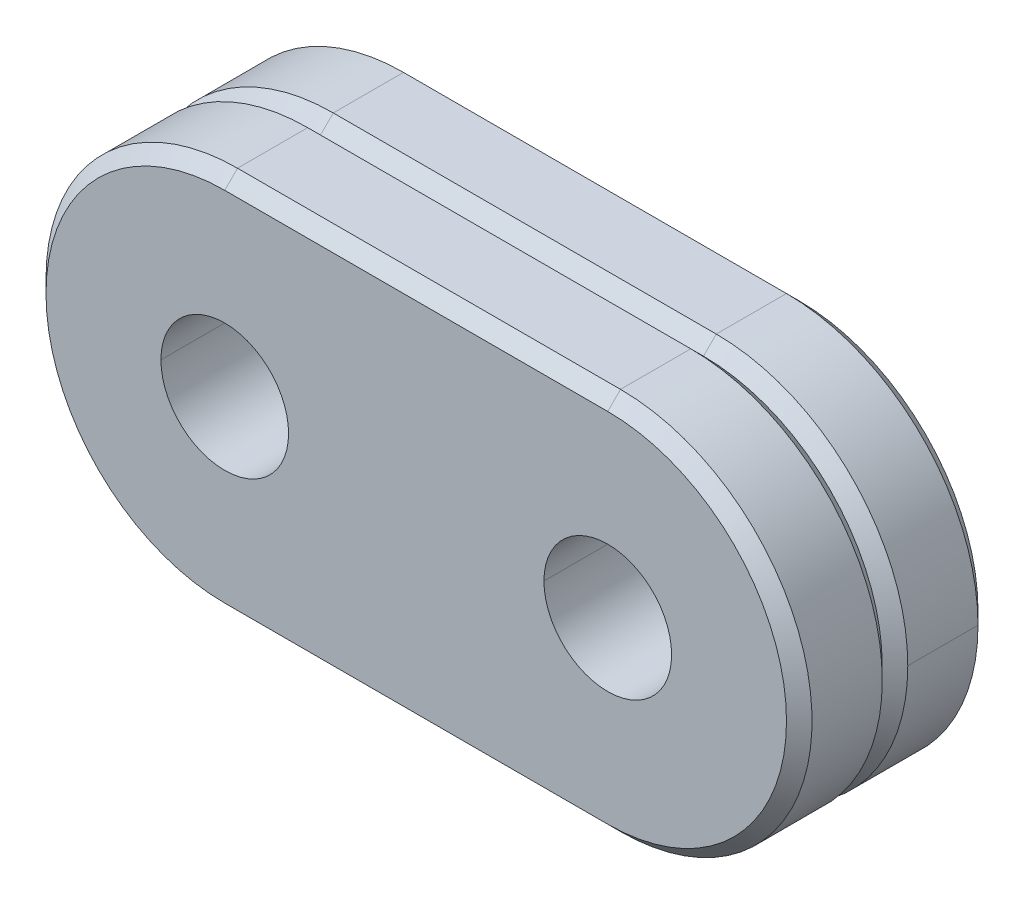
ISO-10303-21;
HEADER;
FILE_DESCRIPTION(('STEP AP214'),'2;1');
FILE_NAME('part.step','',(''),(''),'','','');
FILE_SCHEMA(('AUTOMOTIVE_DESIGN { 1 0 10303 214 1 1 1 1 }'));
ENDSEC;
DATA;
#1=APPLICATION_CONTEXT('core data for automotive mechanical design processes');
#2=APPLICATION_PROTOCOL_DEFINITION('international standard','automotive_design',2000,#1);
#3=PRODUCT_CONTEXT('',#1,'mechanical');
#4=PRODUCT('Part','Part','',(#3));
#5=PRODUCT_RELATED_PRODUCT_CATEGORY('part','',(#4));
#6=PRODUCT_DEFINITION_FORMATION('','',#4);
#7=PRODUCT_DEFINITION_CONTEXT('part definition',#1,'design');
#8=PRODUCT_DEFINITION('design','',#6,#7);
#9=PRODUCT_DEFINITION_SHAPE('','',#8);
#10=(LENGTH_UNIT() NAMED_UNIT(*) SI_UNIT(.MILLI.,.METRE.));
#11=(NAMED_UNIT(*) PLANE_ANGLE_UNIT() SI_UNIT($,.RADIAN.));
#12=(NAMED_UNIT(*) SI_UNIT($,.STERADIAN.) SOLID_ANGLE_UNIT());
#13=UNCERTAINTY_MEASURE_WITH_UNIT(LENGTH_MEASURE(1.E-05),#10,'distance_accuracy_value','');
#14=(GEOMETRIC_REPRESENTATION_CONTEXT(3) GLOBAL_UNCERTAINTY_ASSIGNED_CONTEXT((#13)) GLOBAL_UNIT_ASSIGNED_CONTEXT((#10,
#11,#12)) REPRESENTATION_CONTEXT('',''));
#15=CARTESIAN_POINT('',(0.,0.,0.));
#16=DIRECTION('',(0.,0.,1.));
#17=DIRECTION('',(1.,0.,0.));
#18=AXIS2_PLACEMENT_3D('',#15,#16,#17);
#19=CARTESIAN_POINT('',(0.,-3.,-1.3));
#20=DIRECTION('',(0.,0.707106781186548,0.707106781186548));
#21=DIRECTION('',(1.,0.,0.));
#22=AXIS2_PLACEMENT_3D('',#19,#20,#21);
#23=PLANE('',#22);
#24=DIRECTION('',(0.,0.707106781186548,-0.707106781186548));
#25=VECTOR('',#24,1.);
#26=CARTESIAN_POINT('',(0.,-3.,-1.3));
#27=LINE('',#26,#25);
#28=CARTESIAN_POINT('',(0.,-3.,-1.3));
#29=VERTEX_POINT('',#28);
#30=CARTESIAN_POINT('',(0.,-2.8,-1.5));
#31=VERTEX_POINT('',#30);
#32=EDGE_CURVE('E11',#29,#31,#27,.T.);
#33=ORIENTED_EDGE('',*,*,#32,.T.);
#34=DIRECTION('',(-1.,0.,0.));
#35=VECTOR('',#34,1.);
#36=CARTESIAN_POINT('',(0.,-2.8,-1.5));
#37=LINE('',#36,#35);
#38=CARTESIAN_POINT('',(6.,-2.8,-1.5));
#39=VERTEX_POINT('',#38);
#40=EDGE_CURVE('E268',#39,#31,#37,.T.);
#41=ORIENTED_EDGE('',*,*,#40,.F.);
#42=DIRECTION('',(0.,-0.707106781186548,0.707106781186548));
#43=VECTOR('',#42,1.);
#44=CARTESIAN_POINT('',(6.,-2.8,-1.5));
#45=LINE('',#44,#43);
#46=CARTESIAN_POINT('',(6.,-3.,-1.3));
#47=VERTEX_POINT('',#46);
#48=EDGE_CURVE('E248',#39,#47,#45,.T.);
#49=ORIENTED_EDGE('',*,*,#48,.T.);
#50=DIRECTION('',(1.,0.,0.));
#51=VECTOR('',#50,1.);
#52=CARTESIAN_POINT('',(0.,-3.,-1.3));
#53=LINE('',#52,#51);
#54=EDGE_CURVE('E435',#29,#47,#53,.T.);
#55=ORIENTED_EDGE('',*,*,#54,.F.);
#56=EDGE_LOOP('',(#33,#41,#49,#55));
#57=FACE_BOUND('',#56,.T.);
#58=ADVANCED_FACE('F17',(#57),#23,.F.);
#59=CARTESIAN_POINT('',(6.,0.,-1.3));
#60=DIRECTION('',(0.,0.,1.));
#61=DIRECTION('',(1.,0.,0.));
#62=AXIS2_PLACEMENT_3D('',#59,#60,#61);
#63=CONICAL_SURFACE('',#62,3.,0.785398163397448);
#64=DIRECTION('',(0.707106781186548,0.,0.707106781186548));
#65=VECTOR('',#64,1.);
#66=CARTESIAN_POINT('',(9.,0.,-1.3));
#67=LINE('',#66,#65);
#68=CARTESIAN_POINT('',(8.8,0.,-1.5));
#69=VERTEX_POINT('',#68);
#70=CARTESIAN_POINT('',(9.,0.,-1.3));
#71=VERTEX_POINT('',#70);
#72=EDGE_CURVE('E216',#69,#71,#67,.T.);
#73=ORIENTED_EDGE('',*,*,#72,.F.);
#74=CARTESIAN_POINT('',(6.,0.,-1.5));
#75=DIRECTION('',(0.,0.,-1.));
#76=DIRECTION('',(-1.,0.,0.));
#77=AXIS2_PLACEMENT_3D('',#74,#75,#76);
#78=CIRCLE('',#77,2.8);
#79=CARTESIAN_POINT('',(6.,2.8,-1.5));
#80=VERTEX_POINT('',#79);
#81=EDGE_CURVE('E273',#80,#69,#78,.T.);
#82=ORIENTED_EDGE('',*,*,#81,.F.);
#83=DIRECTION('',(0.,0.707106781186548,0.707106781186548));
#84=VECTOR('',#83,1.);
#85=CARTESIAN_POINT('',(6.,2.8,-1.5));
#86=LINE('',#85,#84);
#87=CARTESIAN_POINT('',(6.,3.,-1.3));
#88=VERTEX_POINT('',#87);
#89=EDGE_CURVE('E218',#80,#88,#86,.T.);
#90=ORIENTED_EDGE('',*,*,#89,.T.);
#91=CARTESIAN_POINT('',(6.,0.,-1.3));
#92=DIRECTION('',(0.,0.,1.));
#93=DIRECTION('',(-1.,0.,0.));
#94=AXIS2_PLACEMENT_3D('',#91,#92,#93);
#95=CIRCLE('',#94,3.);
#96=EDGE_CURVE('E212',#71,#88,#95,.T.);
#97=ORIENTED_EDGE('',*,*,#96,.F.);
#98=EDGE_LOOP('',(#73,#82,#90,#97));
#99=FACE_BOUND('',#98,.T.);
#100=ADVANCED_FACE('F19',(#99),#63,.T.);
#101=CARTESIAN_POINT('',(0.,0.,-1.3));
#102=DIRECTION('',(0.,0.,1.));
#103=DIRECTION('',(1.,0.,0.));
#104=AXIS2_PLACEMENT_3D('',#101,#102,#103);
#105=CONICAL_SURFACE('',#104,3.,0.785398163397448);
#106=DIRECTION('',(0.,-0.707106781186548,-0.707106781186548));
#107=VECTOR('',#106,1.);
#108=CARTESIAN_POINT('',(0.,3.,-1.3));
#109=LINE('',#108,#107);
#110=CARTESIAN_POINT('',(0.,3.,-1.3));
#111=VERTEX_POINT('',#110);
#112=CARTESIAN_POINT('',(0.,2.8,-1.5));
#113=VERTEX_POINT('',#112);
#114=EDGE_CURVE('E28',#111,#113,#109,.T.);
#115=ORIENTED_EDGE('',*,*,#114,.T.);
#116=CARTESIAN_POINT('',(0.,0.,-1.5));
#117=DIRECTION('',(0.,0.,-1.));
#118=DIRECTION('',(-1.,0.,0.));
#119=AXIS2_PLACEMENT_3D('',#116,#117,#118);
#120=CIRCLE('',#119,2.8);
#121=EDGE_CURVE('E272',#31,#113,#120,.T.);
#122=ORIENTED_EDGE('',*,*,#121,.F.);
#123=ORIENTED_EDGE('',*,*,#32,.F.);
#124=CARTESIAN_POINT('',(0.,0.,-1.3));
#125=DIRECTION('',(0.,0.,1.));
#126=DIRECTION('',(-1.,0.,0.));
#127=AXIS2_PLACEMENT_3D('',#124,#125,#126);
#128=CIRCLE('',#127,3.);
#129=EDGE_CURVE('E352',#111,#29,#128,.T.);
#130=ORIENTED_EDGE('',*,*,#129,.F.);
#131=EDGE_LOOP('',(#115,#122,#123,#130));
#132=FACE_BOUND('',#131,.T.);
#133=ADVANCED_FACE('F877',(#132),#105,.T.);
#134=CARTESIAN_POINT('',(0.,3.,-1.3));
#135=DIRECTION('',(0.,-0.707106781186548,0.707106781186548));
#136=DIRECTION('',(-1.,0.,0.));
#137=AXIS2_PLACEMENT_3D('',#134,#135,#136);
#138=PLANE('',#137);
#139=ORIENTED_EDGE('',*,*,#89,.F.);
#140=DIRECTION('',(1.,0.,0.));
#141=VECTOR('',#140,1.);
#142=CARTESIAN_POINT('',(0.,2.8,-1.5));
#143=LINE('',#142,#141);
#144=EDGE_CURVE('E443',#113,#80,#143,.T.);
#145=ORIENTED_EDGE('',*,*,#144,.F.);
#146=ORIENTED_EDGE('',*,*,#114,.F.);
#147=DIRECTION('',(-1.,0.,0.));
#148=VECTOR('',#147,1.);
#149=CARTESIAN_POINT('',(0.,3.,-1.3));
#150=LINE('',#149,#148);
#151=EDGE_CURVE('E224',#88,#111,#150,.T.);
#152=ORIENTED_EDGE('',*,*,#151,.F.);
#153=EDGE_LOOP('',(#139,#145,#146,#152));
#154=FACE_BOUND('',#153,.T.);
#155=ADVANCED_FACE('F881',(#154),#138,.F.);
#156=CARTESIAN_POINT('',(0.,-2.8,0.));
#157=DIRECTION('',(0.,-0.707106781186545,0.707106781186551));
#158=DIRECTION('',(-1.,0.,0.));
#159=AXIS2_PLACEMENT_3D('',#156,#157,#158);
#160=PLANE('',#159);
#161=DIRECTION('',(0.,-0.707106781186551,-0.707106781186545));
#162=VECTOR('',#161,1.);
#163=CARTESIAN_POINT('',(0.,-2.8,0.));
#164=LINE('',#163,#162);
#165=CARTESIAN_POINT('',(0.,-2.8,0.));
#166=VERTEX_POINT('',#165);
#167=CARTESIAN_POINT('',(0.,-3.,-0.199999999999997));
#168=VERTEX_POINT('',#167);
#169=EDGE_CURVE('E236',#166,#168,#164,.T.);
#170=ORIENTED_EDGE('',*,*,#169,.T.);
#171=DIRECTION('',(-1.,0.,0.));
#172=VECTOR('',#171,1.);
#173=CARTESIAN_POINT('',(0.,-3.,-0.199999999999997));
#174=LINE('',#173,#172);
#175=CARTESIAN_POINT('',(6.,-3.,-0.199999999999997));
#176=VERTEX_POINT('',#175);
#177=EDGE_CURVE('E348',#176,#168,#174,.T.);
#178=ORIENTED_EDGE('',*,*,#177,.F.);
#179=DIRECTION('',(0.,0.707106781186551,0.707106781186545));
#180=VECTOR('',#179,1.);
#181=CARTESIAN_POINT('',(6.,-3.,-0.199999999999997));
#182=LINE('',#181,#180);
#183=CARTESIAN_POINT('',(6.,-2.8,0.));
#184=VERTEX_POINT('',#183);
#185=EDGE_CURVE('E458',#176,#184,#182,.T.);
#186=ORIENTED_EDGE('',*,*,#185,.T.);
#187=DIRECTION('',(-1.,0.,0.));
#188=VECTOR('',#187,1.);
#189=CARTESIAN_POINT('',(0.,-2.8,0.));
#190=LINE('',#189,#188);
#191=EDGE_CURVE('E311',#184,#166,#190,.T.);
#192=ORIENTED_EDGE('',*,*,#191,.T.);
#193=EDGE_LOOP('',(#170,#178,#186,#192));
#194=FACE_BOUND('',#193,.T.);
#195=ADVANCED_FACE('F474',(#194),#160,.T.);
#196=CARTESIAN_POINT('',(6.,0.,0.));
#197=DIRECTION('',(0.,0.,-1.));
#198=DIRECTION('',(-1.,0.,0.));
#199=AXIS2_PLACEMENT_3D('',#196,#197,#198);
#200=CONICAL_SURFACE('',#199,2.8,0.785398163397452);
#201=DIRECTION('',(0.,-0.707106781186551,0.707106781186545));
#202=VECTOR('',#201,1.);
#203=CARTESIAN_POINT('',(6.,3.,-0.199999999999997));
#204=LINE('',#203,#202);
#205=CARTESIAN_POINT('',(6.,3.,-0.199999999999997));
#206=VERTEX_POINT('',#205);
#207=CARTESIAN_POINT('',(6.,2.8,0.));
#208=VERTEX_POINT('',#207);
#209=EDGE_CURVE('E439',#206,#208,#204,.T.);
#210=ORIENTED_EDGE('',*,*,#209,.T.);
#211=CARTESIAN_POINT('',(6.,0.,0.));
#212=DIRECTION('',(0.,0.,-1.));
#213=DIRECTION('',(1.,0.,0.));
#214=AXIS2_PLACEMENT_3D('',#211,#212,#213);
#215=CIRCLE('',#214,2.8);
#216=CARTESIAN_POINT('',(8.8,0.,0.));
#217=VERTEX_POINT('',#216);
#218=EDGE_CURVE('E375',#208,#217,#215,.T.);
#219=ORIENTED_EDGE('',*,*,#218,.T.);
#220=CARTESIAN_POINT('',(6.,0.,0.));
#221=DIRECTION('',(0.,0.,-1.));
#222=DIRECTION('',(1.,0.,0.));
#223=AXIS2_PLACEMENT_3D('',#220,#221,#222);
#224=CIRCLE('',#223,2.8);
#225=EDGE_CURVE('E288',#217,#184,#224,.T.);
#226=ORIENTED_EDGE('',*,*,#225,.T.);
#227=ORIENTED_EDGE('',*,*,#185,.F.);
#228=CARTESIAN_POINT('',(6.,0.,-0.199999999999997));
#229=DIRECTION('',(0.,0.,-1.));
#230=DIRECTION('',(-1.,0.,0.));
#231=AXIS2_PLACEMENT_3D('',#228,#229,#230);
#232=CIRCLE('',#231,3.);
#233=CARTESIAN_POINT('',(9.,0.,-0.199999999999997));
#234=VERTEX_POINT('',#233);
#235=EDGE_CURVE('E235',#234,#176,#232,.T.);
#236=ORIENTED_EDGE('',*,*,#235,.F.);
#237=CARTESIAN_POINT('',(6.,0.,-0.199999999999997));
#238=DIRECTION('',(0.,0.,-1.));
#239=DIRECTION('',(-1.,0.,0.));
#240=AXIS2_PLACEMENT_3D('',#237,#238,#239);
#241=CIRCLE('',#240,3.);
#242=EDGE_CURVE('E223',#206,#234,#241,.T.);
#243=ORIENTED_EDGE('',*,*,#242,.F.);
#244=EDGE_LOOP('',(#210,#219,#226,#227,#236,#243));
#245=FACE_BOUND('',#244,.T.);
#246=ADVANCED_FACE('F830',(#245),#200,.T.);
#247=CARTESIAN_POINT('',(0.,0.,0.));
#248=DIRECTION('',(0.,0.,-1.));
#249=DIRECTION('',(-1.,0.,0.));
#250=AXIS2_PLACEMENT_3D('',#247,#248,#249);
#251=CONICAL_SURFACE('',#250,2.8,0.785398163397452);
#252=DIRECTION('',(-0.707106781186551,0.,-0.707106781186545));
#253=VECTOR('',#252,1.);
#254=CARTESIAN_POINT('',(-2.8,0.,0.));
#255=LINE('',#254,#253);
#256=CARTESIAN_POINT('',(-2.8,0.,0.));
#257=VERTEX_POINT('',#256);
#258=CARTESIAN_POINT('',(-3.,0.,-0.199999999999997));
#259=VERTEX_POINT('',#258);
#260=EDGE_CURVE('E365',#257,#259,#255,.T.);
#261=ORIENTED_EDGE('',*,*,#260,.F.);
#262=CARTESIAN_POINT('',(0.,0.,0.));
#263=DIRECTION('',(0.,0.,-1.));
#264=DIRECTION('',(1.,0.,0.));
#265=AXIS2_PLACEMENT_3D('',#262,#263,#264);
#266=CIRCLE('',#265,2.8);
#267=CARTESIAN_POINT('',(0.,2.8,0.));
#268=VERTEX_POINT('',#267);
#269=EDGE_CURVE('E376',#257,#268,#266,.T.);
#270=ORIENTED_EDGE('',*,*,#269,.T.);
#271=DIRECTION('',(0.,0.707106781186551,-0.707106781186545));
#272=VECTOR('',#271,1.);
#273=CARTESIAN_POINT('',(0.,2.8,0.));
#274=LINE('',#273,#272);
#275=CARTESIAN_POINT('',(0.,3.,-0.199999999999997));
#276=VERTEX_POINT('',#275);
#277=EDGE_CURVE('E442',#268,#276,#274,.T.);
#278=ORIENTED_EDGE('',*,*,#277,.T.);
#279=CARTESIAN_POINT('',(0.,0.,-0.199999999999997));
#280=DIRECTION('',(0.,0.,-1.));
#281=DIRECTION('',(-1.,0.,0.));
#282=AXIS2_PLACEMENT_3D('',#279,#280,#281);
#283=CIRCLE('',#282,3.);
#284=EDGE_CURVE('E301',#259,#276,#283,.T.);
#285=ORIENTED_EDGE('',*,*,#284,.F.);
#286=EDGE_LOOP('',(#261,#270,#278,#285));
#287=FACE_BOUND('',#286,.T.);
#288=ADVANCED_FACE('F825',(#287),#251,.T.);
#289=CARTESIAN_POINT('',(0.,2.8,0.));
#290=DIRECTION('',(0.,0.707106781186545,0.707106781186551));
#291=DIRECTION('',(1.,0.,0.));
#292=AXIS2_PLACEMENT_3D('',#289,#290,#291);
#293=PLANE('',#292);
#294=ORIENTED_EDGE('',*,*,#209,.F.);
#295=DIRECTION('',(1.,0.,0.));
#296=VECTOR('',#295,1.);
#297=CARTESIAN_POINT('',(6.,3.,-0.199999999999997));
#298=LINE('',#297,#296);
#299=EDGE_CURVE('E267',#276,#206,#298,.T.);
#300=ORIENTED_EDGE('',*,*,#299,.F.);
#301=ORIENTED_EDGE('',*,*,#277,.F.);
#302=DIRECTION('',(1.,0.,0.));
#303=VECTOR('',#302,1.);
#304=CARTESIAN_POINT('',(0.,2.8,0.));
#305=LINE('',#304,#303);
#306=EDGE_CURVE('E274',#268,#208,#305,.T.);
#307=ORIENTED_EDGE('',*,*,#306,.T.);
#308=EDGE_LOOP('',(#294,#300,#301,#307));
#309=FACE_BOUND('',#308,.T.);
#310=ADVANCED_FACE('F829',(#309),#293,.T.);
#311=CARTESIAN_POINT('',(0.,0.,-1.5));
#312=DIRECTION('',(0.,0.,-1.));
#313=DIRECTION('',(0.,-1.,0.));
#314=AXIS2_PLACEMENT_3D('',#311,#312,#313);
#315=PLANE('',#314);
#316=CARTESIAN_POINT('',(6.,0.,-1.5));
#317=DIRECTION('',(0.,0.,1.));
#318=DIRECTION('',(1.,0.,0.));
#319=AXIS2_PLACEMENT_3D('',#316,#317,#318);
#320=CIRCLE('',#319,1.);
#321=CARTESIAN_POINT('',(5.,0.,-1.5));
#322=VERTEX_POINT('',#321);
#323=CARTESIAN_POINT('',(7.,0.,-1.5));
#324=VERTEX_POINT('',#323);
#325=EDGE_CURVE('E358',#322,#324,#320,.T.);
#326=ORIENTED_EDGE('',*,*,#325,.T.);
#327=CARTESIAN_POINT('',(6.,0.,-1.5));
#328=DIRECTION('',(0.,0.,1.));
#329=DIRECTION('',(1.,0.,0.));
#330=AXIS2_PLACEMENT_3D('',#327,#328,#329);
#331=CIRCLE('',#330,1.);
#332=EDGE_CURVE('E330',#324,#322,#331,.T.);
#333=ORIENTED_EDGE('',*,*,#332,.T.);
#334=EDGE_LOOP('',(#326,#333));
#335=FACE_BOUND('',#334,.T.);
#336=CARTESIAN_POINT('',(0.,0.,-1.5));
#337=DIRECTION('',(0.,0.,1.));
#338=DIRECTION('',(1.,0.,0.));
#339=AXIS2_PLACEMENT_3D('',#336,#337,#338);
#340=CIRCLE('',#339,1.);
#341=CARTESIAN_POINT('',(-1.,0.,-1.5));
#342=VERTEX_POINT('',#341);
#343=CARTESIAN_POINT('',(1.,0.,-1.5));
#344=VERTEX_POINT('',#343);
#345=EDGE_CURVE('E290',#342,#344,#340,.T.);
#346=ORIENTED_EDGE('',*,*,#345,.T.);
#347=CARTESIAN_POINT('',(0.,0.,-1.5));
#348=DIRECTION('',(0.,0.,1.));
#349=DIRECTION('',(1.,0.,0.));
#350=AXIS2_PLACEMENT_3D('',#347,#348,#349);
#351=CIRCLE('',#350,1.);
#352=EDGE_CURVE('E333',#344,#342,#351,.T.);
#353=ORIENTED_EDGE('',*,*,#352,.T.);
#354=EDGE_LOOP('',(#346,#353));
#355=FACE_BOUND('',#354,.T.);
#356=ORIENTED_EDGE('',*,*,#81,.T.);
#357=CARTESIAN_POINT('',(6.,0.,-1.5));
#358=DIRECTION('',(0.,0.,-1.));
#359=DIRECTION('',(-1.,0.,0.));
#360=AXIS2_PLACEMENT_3D('',#357,#358,#359);
#361=CIRCLE('',#360,2.8);
#362=EDGE_CURVE('E252',#69,#39,#361,.T.);
#363=ORIENTED_EDGE('',*,*,#362,.T.);
#364=ORIENTED_EDGE('',*,*,#40,.T.);
#365=ORIENTED_EDGE('',*,*,#121,.T.);
#366=ORIENTED_EDGE('',*,*,#144,.T.);
#367=EDGE_LOOP('',(#356,#363,#364,#365,#366));
#368=FACE_BOUND('',#367,.T.);
#369=ADVANCED_FACE('F904',(#335,#355,#368),#315,.T.);
#370=CARTESIAN_POINT('',(0.,-3.,-1.5));
#371=DIRECTION('',(0.,-1.,0.));
#372=DIRECTION('',(0.,0.,-1.));
#373=AXIS2_PLACEMENT_3D('',#370,#371,#372);
#374=PLANE('',#373);
#375=DIRECTION('',(0.,0.,1.));
#376=VECTOR('',#375,1.);
#377=CARTESIAN_POINT('',(6.,-3.,-1.5));
#378=LINE('',#377,#376);
#379=EDGE_CURVE('E243',#47,#176,#378,.T.);
#380=ORIENTED_EDGE('',*,*,#379,.T.);
#381=ORIENTED_EDGE('',*,*,#177,.T.);
#382=DIRECTION('',(0.,0.,1.));
#383=VECTOR('',#382,1.);
#384=CARTESIAN_POINT('',(0.,-3.,-1.5));
#385=LINE('',#384,#383);
#386=EDGE_CURVE('E306',#29,#168,#385,.T.);
#387=ORIENTED_EDGE('',*,*,#386,.F.);
#388=ORIENTED_EDGE('',*,*,#54,.T.);
#389=EDGE_LOOP('',(#380,#381,#387,#388));
#390=FACE_BOUND('',#389,.T.);
#391=ADVANCED_FACE('F1073',(#390),#374,.T.);
#392=CARTESIAN_POINT('',(6.,0.,-1.5));
#393=DIRECTION('',(0.,0.,1.));
#394=DIRECTION('',(1.,0.,0.));
#395=AXIS2_PLACEMENT_3D('',#392,#393,#394);
#396=CYLINDRICAL_SURFACE('',#395,3.);
#397=DIRECTION('',(0.,0.,1.));
#398=VECTOR('',#397,1.);
#399=CARTESIAN_POINT('',(9.,0.,-1.5));
#400=LINE('',#399,#398);
#401=EDGE_CURVE('E227',#71,#234,#400,.T.);
#402=ORIENTED_EDGE('',*,*,#401,.F.);
#403=ORIENTED_EDGE('',*,*,#96,.T.);
#404=DIRECTION('',(0.,0.,1.));
#405=VECTOR('',#404,1.);
#406=CARTESIAN_POINT('',(6.,3.,-1.5));
#407=LINE('',#406,#405);
#408=EDGE_CURVE('E264',#88,#206,#407,.T.);
#409=ORIENTED_EDGE('',*,*,#408,.T.);
#410=ORIENTED_EDGE('',*,*,#242,.T.);
#411=EDGE_LOOP('',(#402,#403,#409,#410));
#412=FACE_BOUND('',#411,.T.);
#413=ADVANCED_FACE('F229',(#412),#396,.T.);
#414=CARTESIAN_POINT('',(0.,3.,-1.5));
#415=DIRECTION('',(0.,1.,0.));
#416=DIRECTION('',(1.,0.,0.));
#417=AXIS2_PLACEMENT_3D('',#414,#415,#416);
#418=PLANE('',#417);
#419=DIRECTION('',(0.,0.,1.));
#420=VECTOR('',#419,1.);
#421=CARTESIAN_POINT('',(0.,3.,-1.5));
#422=LINE('',#421,#420);
#423=EDGE_CURVE('E305',#111,#276,#422,.T.);
#424=ORIENTED_EDGE('',*,*,#423,.T.);
#425=ORIENTED_EDGE('',*,*,#299,.T.);
#426=ORIENTED_EDGE('',*,*,#408,.F.);
#427=ORIENTED_EDGE('',*,*,#151,.T.);
#428=EDGE_LOOP('',(#424,#425,#426,#427));
#429=FACE_BOUND('',#428,.T.);
#430=ADVANCED_FACE('F994',(#429),#418,.T.);
#431=CARTESIAN_POINT('',(0.,0.,-1.5));
#432=DIRECTION('',(0.,0.,1.));
#433=DIRECTION('',(1.,0.,0.));
#434=AXIS2_PLACEMENT_3D('',#431,#432,#433);
#435=CYLINDRICAL_SURFACE('',#434,3.);
#436=ORIENTED_EDGE('',*,*,#386,.T.);
#437=CARTESIAN_POINT('',(0.,0.,-0.199999999999997));
#438=DIRECTION('',(0.,0.,-1.));
#439=DIRECTION('',(-1.,0.,0.));
#440=AXIS2_PLACEMENT_3D('',#437,#438,#439);
#441=CIRCLE('',#440,3.);
#442=EDGE_CURVE('E369',#168,#259,#441,.T.);
#443=ORIENTED_EDGE('',*,*,#442,.T.);
#444=ORIENTED_EDGE('',*,*,#284,.T.);
#445=ORIENTED_EDGE('',*,*,#423,.F.);
#446=ORIENTED_EDGE('',*,*,#129,.T.);
#447=EDGE_LOOP('',(#436,#443,#444,#445,#446));
#448=FACE_BOUND('',#447,.T.);
#449=ADVANCED_FACE('F482',(#448),#435,.T.);
#450=CARTESIAN_POINT('',(0.,-2.8,1.5));
#451=DIRECTION('',(0.,-0.707106781186551,0.707106781186545));
#452=DIRECTION('',(-1.,0.,0.));
#453=AXIS2_PLACEMENT_3D('',#450,#451,#452);
#454=PLANE('',#453);
#455=DIRECTION('',(0.,-0.707106781186545,-0.707106781186551));
#456=VECTOR('',#455,1.);
#457=CARTESIAN_POINT('',(0.,-2.8,1.5));
#458=LINE('',#457,#456);
#459=CARTESIAN_POINT('',(0.,-2.8,1.5));
#460=VERTEX_POINT('',#459);
#461=CARTESIAN_POINT('',(0.,-3.,1.3));
#462=VERTEX_POINT('',#461);
#463=EDGE_CURVE('E284',#460,#462,#458,.T.);
#464=ORIENTED_EDGE('',*,*,#463,.T.);
#465=DIRECTION('',(-1.,0.,0.));
#466=VECTOR('',#465,1.);
#467=CARTESIAN_POINT('',(0.,-3.,1.3));
#468=LINE('',#467,#466);
#469=CARTESIAN_POINT('',(6.,-3.,1.3));
#470=VERTEX_POINT('',#469);
#471=EDGE_CURVE('E283',#470,#462,#468,.T.);
#472=ORIENTED_EDGE('',*,*,#471,.F.);
#473=DIRECTION('',(0.,0.707106781186545,0.707106781186551));
#474=VECTOR('',#473,1.);
#475=CARTESIAN_POINT('',(6.,-3.,1.3));
#476=LINE('',#475,#474);
#477=CARTESIAN_POINT('',(6.,-2.8,1.5));
#478=VERTEX_POINT('',#477);
#479=EDGE_CURVE('E450',#470,#478,#476,.T.);
#480=ORIENTED_EDGE('',*,*,#479,.T.);
#481=DIRECTION('',(1.,0.,0.));
#482=VECTOR('',#481,1.);
#483=CARTESIAN_POINT('',(6.,-2.8,1.5));
#484=LINE('',#483,#482);
#485=EDGE_CURVE('E387',#460,#478,#484,.T.);
#486=ORIENTED_EDGE('',*,*,#485,.F.);
#487=EDGE_LOOP('',(#464,#472,#480,#486));
#488=FACE_BOUND('',#487,.T.);
#489=ADVANCED_FACE('F976',(#488),#454,.T.);
#490=CARTESIAN_POINT('',(6.,0.,1.5));
#491=DIRECTION('',(0.,0.,-1.));
#492=DIRECTION('',(-1.,0.,0.));
#493=AXIS2_PLACEMENT_3D('',#490,#491,#492);
#494=CONICAL_SURFACE('',#493,2.8,0.785398163397443);
#495=DIRECTION('',(0.,-0.707106781186545,0.707106781186551));
#496=VECTOR('',#495,1.);
#497=CARTESIAN_POINT('',(6.,3.,1.3));
#498=LINE('',#497,#496);
#499=CARTESIAN_POINT('',(6.,3.,1.3));
#500=VERTEX_POINT('',#499);
#501=CARTESIAN_POINT('',(6.,2.8,1.5));
#502=VERTEX_POINT('',#501);
#503=EDGE_CURVE('E307',#500,#502,#498,.T.);
#504=ORIENTED_EDGE('',*,*,#503,.T.);
#505=CARTESIAN_POINT('',(6.,0.,1.5));
#506=DIRECTION('',(0.,0.,1.));
#507=DIRECTION('',(1.,0.,0.));
#508=AXIS2_PLACEMENT_3D('',#505,#506,#507);
#509=CIRCLE('',#508,2.8);
#510=EDGE_CURVE('E395',#478,#502,#509,.T.);
#511=ORIENTED_EDGE('',*,*,#510,.F.);
#512=ORIENTED_EDGE('',*,*,#479,.F.);
#513=CARTESIAN_POINT('',(6.,0.,1.3));
#514=DIRECTION('',(0.,0.,-1.));
#515=DIRECTION('',(1.,0.,0.));
#516=AXIS2_PLACEMENT_3D('',#513,#514,#515);
#517=CIRCLE('',#516,3.);
#518=EDGE_CURVE('E359',#500,#470,#517,.T.);
#519=ORIENTED_EDGE('',*,*,#518,.F.);
#520=EDGE_LOOP('',(#504,#511,#512,#519));
#521=FACE_BOUND('',#520,.T.);
#522=ADVANCED_FACE('F972',(#521),#494,.T.);
#523=CARTESIAN_POINT('',(0.,0.,1.5));
#524=DIRECTION('',(0.,0.,-1.));
#525=DIRECTION('',(-1.,0.,0.));
#526=AXIS2_PLACEMENT_3D('',#523,#524,#525);
#527=CONICAL_SURFACE('',#526,2.8,0.785398163397443);
#528=DIRECTION('',(-0.707106781186545,0.,-0.707106781186551));
#529=VECTOR('',#528,1.);
#530=CARTESIAN_POINT('',(-2.8,0.,1.5));
#531=LINE('',#530,#529);
#532=CARTESIAN_POINT('',(-2.8,0.,1.5));
#533=VERTEX_POINT('',#532);
#534=CARTESIAN_POINT('',(-3.,0.,1.3));
#535=VERTEX_POINT('',#534);
#536=EDGE_CURVE('E324',#533,#535,#531,.T.);
#537=ORIENTED_EDGE('',*,*,#536,.F.);
#538=CARTESIAN_POINT('',(0.,0.,1.5));
#539=DIRECTION('',(0.,0.,1.));
#540=DIRECTION('',(1.,0.,0.));
#541=AXIS2_PLACEMENT_3D('',#538,#539,#540);
#542=CIRCLE('',#541,2.8);
#543=CARTESIAN_POINT('',(0.,2.8,1.5));
#544=VERTEX_POINT('',#543);
#545=EDGE_CURVE('E342',#544,#533,#542,.T.);
#546=ORIENTED_EDGE('',*,*,#545,.F.);
#547=DIRECTION('',(0.,0.707106781186545,-0.707106781186551));
#548=VECTOR('',#547,1.);
#549=CARTESIAN_POINT('',(0.,2.8,1.5));
#550=LINE('',#549,#548);
#551=CARTESIAN_POINT('',(0.,3.,1.3));
#552=VERTEX_POINT('',#551);
#553=EDGE_CURVE('E310',#544,#552,#550,.T.);
#554=ORIENTED_EDGE('',*,*,#553,.T.);
#555=CARTESIAN_POINT('',(0.,0.,1.3));
#556=DIRECTION('',(0.,0.,-1.));
#557=DIRECTION('',(1.,0.,0.));
#558=AXIS2_PLACEMENT_3D('',#555,#556,#557);
#559=CIRCLE('',#558,3.);
#560=EDGE_CURVE('E299',#535,#552,#559,.T.);
#561=ORIENTED_EDGE('',*,*,#560,.F.);
#562=EDGE_LOOP('',(#537,#546,#554,#561));
#563=FACE_BOUND('',#562,.T.);
#564=ADVANCED_FACE('F915',(#563),#527,.T.);
#565=CARTESIAN_POINT('',(0.,2.8,1.5));
#566=DIRECTION('',(0.,0.707106781186551,0.707106781186545));
#567=DIRECTION('',(1.,0.,0.));
#568=AXIS2_PLACEMENT_3D('',#565,#566,#567);
#569=PLANE('',#568);
#570=ORIENTED_EDGE('',*,*,#503,.F.);
#571=DIRECTION('',(1.,0.,0.));
#572=VECTOR('',#571,1.);
#573=CARTESIAN_POINT('',(6.,3.,1.3));
#574=LINE('',#573,#572);
#575=EDGE_CURVE('E334',#552,#500,#574,.T.);
#576=ORIENTED_EDGE('',*,*,#575,.F.);
#577=ORIENTED_EDGE('',*,*,#553,.F.);
#578=DIRECTION('',(-1.,0.,0.));
#579=VECTOR('',#578,1.);
#580=CARTESIAN_POINT('',(0.,2.8,1.5));
#581=LINE('',#580,#579);
#582=EDGE_CURVE('E399',#502,#544,#581,.T.);
#583=ORIENTED_EDGE('',*,*,#582,.F.);
#584=EDGE_LOOP('',(#570,#576,#577,#583));
#585=FACE_BOUND('',#584,.T.);
#586=ADVANCED_FACE('F910',(#585),#569,.T.);
#587=CARTESIAN_POINT('',(0.,-3.,0.2));
#588=DIRECTION('',(0.,0.707106781186545,0.707106781186551));
#589=DIRECTION('',(1.,0.,0.));
#590=AXIS2_PLACEMENT_3D('',#587,#588,#589);
#591=PLANE('',#590);
#592=DIRECTION('',(0.,0.707106781186551,-0.707106781186545));
#593=VECTOR('',#592,1.);
#594=CARTESIAN_POINT('',(0.,-3.,0.2));
#595=LINE('',#594,#593);
#596=CARTESIAN_POINT('',(0.,-3.,0.2));
#597=VERTEX_POINT('',#596);
#598=EDGE_CURVE('E371',#597,#166,#595,.T.);
#599=ORIENTED_EDGE('',*,*,#598,.T.);
#600=ORIENTED_EDGE('',*,*,#191,.F.);
#601=DIRECTION('',(0.,-0.707106781186551,0.707106781186545));
#602=VECTOR('',#601,1.);
#603=CARTESIAN_POINT('',(6.,-2.8,0.));
#604=LINE('',#603,#602);
#605=CARTESIAN_POINT('',(6.,-3.,0.2));
#606=VERTEX_POINT('',#605);
#607=EDGE_CURVE('E329',#184,#606,#604,.T.);
#608=ORIENTED_EDGE('',*,*,#607,.T.);
#609=DIRECTION('',(1.,0.,0.));
#610=VECTOR('',#609,1.);
#611=CARTESIAN_POINT('',(0.,-3.,0.2));
#612=LINE('',#611,#610);
#613=EDGE_CURVE('E21',#597,#606,#612,.T.);
#614=ORIENTED_EDGE('',*,*,#613,.F.);
#615=EDGE_LOOP('',(#599,#600,#608,#614));
#616=FACE_BOUND('',#615,.T.);
#617=ADVANCED_FACE('F914',(#616),#591,.F.);
#618=CARTESIAN_POINT('',(6.,0.,0.2));
#619=DIRECTION('',(0.,0.,1.));
#620=DIRECTION('',(1.,0.,0.));
#621=AXIS2_PLACEMENT_3D('',#618,#619,#620);
#622=CONICAL_SURFACE('',#621,3.,0.785398163397452);
#623=DIRECTION('',(0.707106781186551,0.,0.707106781186545));
#624=VECTOR('',#623,1.);
#625=CARTESIAN_POINT('',(9.,0.,0.2));
#626=LINE('',#625,#624);
#627=CARTESIAN_POINT('',(9.,0.,0.2));
#628=VERTEX_POINT('',#627);
#629=EDGE_CURVE('E315',#217,#628,#626,.T.);
#630=ORIENTED_EDGE('',*,*,#629,.F.);
#631=ORIENTED_EDGE('',*,*,#218,.F.);
#632=DIRECTION('',(0.,0.707106781186551,0.707106781186545));
#633=VECTOR('',#632,1.);
#634=CARTESIAN_POINT('',(6.,2.8,0.));
#635=LINE('',#634,#633);
#636=CARTESIAN_POINT('',(6.,3.,0.2));
#637=VERTEX_POINT('',#636);
#638=EDGE_CURVE('E278',#208,#637,#635,.T.);
#639=ORIENTED_EDGE('',*,*,#638,.T.);
#640=CARTESIAN_POINT('',(6.,0.,0.2));
#641=DIRECTION('',(0.,0.,1.));
#642=DIRECTION('',(1.,0.,0.));
#643=AXIS2_PLACEMENT_3D('',#640,#641,#642);
#644=CIRCLE('',#643,3.);
#645=EDGE_CURVE('E337',#628,#637,#644,.T.);
#646=ORIENTED_EDGE('',*,*,#645,.F.);
#647=EDGE_LOOP('',(#630,#631,#639,#646));
#648=FACE_BOUND('',#647,.T.);
#649=ADVANCED_FACE('F941',(#648),#622,.T.);
#650=CARTESIAN_POINT('',(0.,0.,0.2));
#651=DIRECTION('',(0.,0.,1.));
#652=DIRECTION('',(1.,0.,0.));
#653=AXIS2_PLACEMENT_3D('',#650,#651,#652);
#654=CONICAL_SURFACE('',#653,3.,0.785398163397452);
#655=DIRECTION('',(0.,-0.707106781186551,-0.707106781186545));
#656=VECTOR('',#655,1.);
#657=CARTESIAN_POINT('',(0.,3.,0.2));
#658=LINE('',#657,#656);
#659=CARTESIAN_POINT('',(0.,3.,0.2));
#660=VERTEX_POINT('',#659);
#661=EDGE_CURVE('E277',#660,#268,#658,.T.);
#662=ORIENTED_EDGE('',*,*,#661,.T.);
#663=ORIENTED_EDGE('',*,*,#269,.F.);
#664=CARTESIAN_POINT('',(0.,0.,0.));
#665=DIRECTION('',(0.,0.,-1.));
#666=DIRECTION('',(1.,0.,0.));
#667=AXIS2_PLACEMENT_3D('',#664,#665,#666);
#668=CIRCLE('',#667,2.8);
#669=EDGE_CURVE('E370',#166,#257,#668,.T.);
#670=ORIENTED_EDGE('',*,*,#669,.F.);
#671=ORIENTED_EDGE('',*,*,#598,.F.);
#672=CARTESIAN_POINT('',(0.,0.,0.2));
#673=DIRECTION('',(0.,0.,1.));
#674=DIRECTION('',(1.,0.,0.));
#675=AXIS2_PLACEMENT_3D('',#672,#673,#674);
#676=CIRCLE('',#675,3.);
#677=CARTESIAN_POINT('',(-3.,0.,0.2));
#678=VERTEX_POINT('',#677);
#679=EDGE_CURVE('E343',#678,#597,#676,.T.);
#680=ORIENTED_EDGE('',*,*,#679,.F.);
#681=CARTESIAN_POINT('',(0.,0.,0.2));
#682=DIRECTION('',(0.,0.,1.));
#683=DIRECTION('',(1.,0.,0.));
#684=AXIS2_PLACEMENT_3D('',#681,#682,#683);
#685=CIRCLE('',#684,3.);
#686=EDGE_CURVE('E447',#660,#678,#685,.T.);
#687=ORIENTED_EDGE('',*,*,#686,.F.);
#688=EDGE_LOOP('',(#662,#663,#670,#671,#680,#687));
#689=FACE_BOUND('',#688,.T.);
#690=ADVANCED_FACE('F925',(#689),#654,.T.);
#691=CARTESIAN_POINT('',(0.,3.,0.2));
#692=DIRECTION('',(0.,-0.707106781186545,0.707106781186551));
#693=DIRECTION('',(-1.,0.,0.));
#694=AXIS2_PLACEMENT_3D('',#691,#692,#693);
#695=PLANE('',#694);
#696=ORIENTED_EDGE('',*,*,#638,.F.);
#697=ORIENTED_EDGE('',*,*,#306,.F.);
#698=ORIENTED_EDGE('',*,*,#661,.F.);
#699=DIRECTION('',(-1.,0.,0.));
#700=VECTOR('',#699,1.);
#701=CARTESIAN_POINT('',(0.,3.,0.2));
#702=LINE('',#701,#700);
#703=EDGE_CURVE('E363',#637,#660,#702,.T.);
#704=ORIENTED_EDGE('',*,*,#703,.F.);
#705=EDGE_LOOP('',(#696,#697,#698,#704));
#706=FACE_BOUND('',#705,.T.);
#707=ADVANCED_FACE('F921',(#706),#695,.F.);
#708=CARTESIAN_POINT('',(0.,0.,1.5));
#709=DIRECTION('',(0.,0.,-1.));
#710=DIRECTION('',(-1.,0.,0.));
#711=AXIS2_PLACEMENT_3D('',#708,#709,#710);
#712=CYLINDRICAL_SURFACE('',#711,1.);
#713=DIRECTION('',(0.,0.,-1.));
#714=VECTOR('',#713,1.);
#715=CARTESIAN_POINT('',(1.,0.,1.5));
#716=LINE('',#715,#714);
#717=CARTESIAN_POINT('',(1.,0.,1.5));
#718=VERTEX_POINT('',#717);
#719=EDGE_CURVE('E295',#718,#344,#716,.T.);
#720=ORIENTED_EDGE('',*,*,#719,.F.);
#721=CARTESIAN_POINT('',(0.,0.,1.5));
#722=DIRECTION('',(0.,0.,1.));
#723=DIRECTION('',(1.,0.,0.));
#724=AXIS2_PLACEMENT_3D('',#721,#722,#723);
#725=CIRCLE('',#724,1.);
#726=CARTESIAN_POINT('',(-1.,0.,1.5));
#727=VERTEX_POINT('',#726);
#728=EDGE_CURVE('E296',#718,#727,#725,.T.);
#729=ORIENTED_EDGE('',*,*,#728,.T.);
#730=DIRECTION('',(0.,0.,-1.));
#731=VECTOR('',#730,1.);
#732=CARTESIAN_POINT('',(-1.,0.,1.5));
#733=LINE('',#732,#731);
#734=EDGE_CURVE('E294',#727,#342,#733,.T.);
#735=ORIENTED_EDGE('',*,*,#734,.T.);
#736=ORIENTED_EDGE('',*,*,#352,.F.);
#737=EDGE_LOOP('',(#720,#729,#735,#736));
#738=FACE_BOUND('',#737,.T.);
#739=ADVANCED_FACE('F841',(#738),#712,.F.);
#740=CARTESIAN_POINT('',(6.,0.,1.5));
#741=DIRECTION('',(0.,0.,-1.));
#742=DIRECTION('',(-1.,0.,0.));
#743=AXIS2_PLACEMENT_3D('',#740,#741,#742);
#744=CYLINDRICAL_SURFACE('',#743,1.);
#745=DIRECTION('',(0.,0.,-1.));
#746=VECTOR('',#745,1.);
#747=CARTESIAN_POINT('',(7.,0.,1.5));
#748=LINE('',#747,#746);
#749=CARTESIAN_POINT('',(7.,0.,1.5));
#750=VERTEX_POINT('',#749);
#751=EDGE_CURVE('E262',#750,#324,#748,.T.);
#752=ORIENTED_EDGE('',*,*,#751,.F.);
#753=CARTESIAN_POINT('',(6.,0.,1.5));
#754=DIRECTION('',(0.,0.,1.));
#755=DIRECTION('',(1.,0.,0.));
#756=AXIS2_PLACEMENT_3D('',#753,#754,#755);
#757=CIRCLE('',#756,1.);
#758=CARTESIAN_POINT('',(5.,0.,1.5));
#759=VERTEX_POINT('',#758);
#760=EDGE_CURVE('E300',#750,#759,#757,.T.);
#761=ORIENTED_EDGE('',*,*,#760,.T.);
#762=DIRECTION('',(0.,0.,-1.));
#763=VECTOR('',#762,1.);
#764=CARTESIAN_POINT('',(5.,0.,1.5));
#765=LINE('',#764,#763);
#766=EDGE_CURVE('E353',#759,#322,#765,.T.);
#767=ORIENTED_EDGE('',*,*,#766,.T.);
#768=ORIENTED_EDGE('',*,*,#332,.F.);
#769=EDGE_LOOP('',(#752,#761,#767,#768));
#770=FACE_BOUND('',#769,.T.);
#771=ADVANCED_FACE('F836',(#770),#744,.F.);
#772=CARTESIAN_POINT('',(0.,3.,1.5));
#773=DIRECTION('',(0.,-1.,0.));
#774=DIRECTION('',(0.,0.,-1.));
#775=AXIS2_PLACEMENT_3D('',#772,#773,#774);
#776=PLANE('',#775);
#777=DIRECTION('',(0.,0.,-1.));
#778=VECTOR('',#777,1.);
#779=CARTESIAN_POINT('',(6.,3.,1.5));
#780=LINE('',#779,#778);
#781=EDGE_CURVE('E364',#500,#637,#780,.T.);
#782=ORIENTED_EDGE('',*,*,#781,.T.);
#783=ORIENTED_EDGE('',*,*,#703,.T.);
#784=DIRECTION('',(0.,0.,-1.));
#785=VECTOR('',#784,1.);
#786=CARTESIAN_POINT('',(0.,3.,1.5));
#787=LINE('',#786,#785);
#788=EDGE_CURVE('E394',#552,#660,#787,.T.);
#789=ORIENTED_EDGE('',*,*,#788,.F.);
#790=ORIENTED_EDGE('',*,*,#575,.T.);
#791=EDGE_LOOP('',(#782,#783,#789,#790));
#792=FACE_BOUND('',#791,.T.);
#793=ADVANCED_FACE('F840',(#792),#776,.F.);
#794=CARTESIAN_POINT('',(6.,0.,1.5));
#795=DIRECTION('',(0.,0.,-1.));
#796=DIRECTION('',(-1.,0.,0.));
#797=AXIS2_PLACEMENT_3D('',#794,#795,#796);
#798=CYLINDRICAL_SURFACE('',#797,3.);
#799=DIRECTION('',(0.,0.,-1.));
#800=VECTOR('',#799,1.);
#801=CARTESIAN_POINT('',(6.,-3.,1.5));
#802=LINE('',#801,#800);
#803=EDGE_CURVE('E280',#470,#606,#802,.T.);
#804=ORIENTED_EDGE('',*,*,#803,.T.);
#805=CARTESIAN_POINT('',(6.,0.,0.2));
#806=DIRECTION('',(0.,0.,1.));
#807=DIRECTION('',(1.,0.,0.));
#808=AXIS2_PLACEMENT_3D('',#805,#806,#807);
#809=CIRCLE('',#808,3.);
#810=EDGE_CURVE('E319',#606,#628,#809,.T.);
#811=ORIENTED_EDGE('',*,*,#810,.T.);
#812=ORIENTED_EDGE('',*,*,#645,.T.);
#813=ORIENTED_EDGE('',*,*,#781,.F.);
#814=ORIENTED_EDGE('',*,*,#518,.T.);
#815=EDGE_LOOP('',(#804,#811,#812,#813,#814));
#816=FACE_BOUND('',#815,.T.);
#817=ADVANCED_FACE('F954',(#816),#798,.T.);
#818=CARTESIAN_POINT('',(0.,-3.,1.5));
#819=DIRECTION('',(0.,1.,0.));
#820=DIRECTION('',(1.,0.,0.));
#821=AXIS2_PLACEMENT_3D('',#818,#819,#820);
#822=PLANE('',#821);
#823=DIRECTION('',(0.,0.,-1.));
#824=VECTOR('',#823,1.);
#825=CARTESIAN_POINT('',(0.,-3.,1.5));
#826=LINE('',#825,#824);
#827=EDGE_CURVE('E338',#462,#597,#826,.T.);
#828=ORIENTED_EDGE('',*,*,#827,.T.);
#829=ORIENTED_EDGE('',*,*,#613,.T.);
#830=ORIENTED_EDGE('',*,*,#803,.F.);
#831=ORIENTED_EDGE('',*,*,#471,.T.);
#832=EDGE_LOOP('',(#828,#829,#830,#831));
#833=FACE_BOUND('',#832,.T.);
#834=ADVANCED_FACE('F958',(#833),#822,.F.);
#835=CARTESIAN_POINT('',(0.,0.,1.5));
#836=DIRECTION('',(0.,0.,-1.));
#837=DIRECTION('',(-1.,0.,0.));
#838=AXIS2_PLACEMENT_3D('',#835,#836,#837);
#839=CYLINDRICAL_SURFACE('',#838,3.);
#840=DIRECTION('',(0.,0.,-1.));
#841=VECTOR('',#840,1.);
#842=CARTESIAN_POINT('',(-3.,0.,1.5));
#843=LINE('',#842,#841);
#844=EDGE_CURVE('E357',#535,#678,#843,.T.);
#845=ORIENTED_EDGE('',*,*,#844,.F.);
#846=ORIENTED_EDGE('',*,*,#560,.T.);
#847=ORIENTED_EDGE('',*,*,#788,.T.);
#848=ORIENTED_EDGE('',*,*,#686,.T.);
#849=EDGE_LOOP('',(#845,#846,#847,#848));
#850=FACE_BOUND('',#849,.T.);
#851=ADVANCED_FACE('F985',(#850),#839,.T.);
#852=CARTESIAN_POINT('',(0.,0.,1.5));
#853=DIRECTION('',(0.,0.,1.));
#854=DIRECTION('',(1.,0.,0.));
#855=AXIS2_PLACEMENT_3D('',#852,#853,#854);
#856=PLANE('',#855);
#857=CARTESIAN_POINT('',(0.,0.,1.5));
#858=DIRECTION('',(0.,0.,1.));
#859=DIRECTION('',(1.,0.,0.));
#860=AXIS2_PLACEMENT_3D('',#857,#858,#859);
#861=CIRCLE('',#860,1.);
#862=EDGE_CURVE('E325',#727,#718,#861,.T.);
#863=ORIENTED_EDGE('',*,*,#862,.F.);
#864=ORIENTED_EDGE('',*,*,#728,.F.);
#865=EDGE_LOOP('',(#863,#864));
#866=FACE_BOUND('',#865,.T.);
#867=CARTESIAN_POINT('',(6.,0.,1.5));
#868=DIRECTION('',(0.,0.,1.));
#869=DIRECTION('',(1.,0.,0.));
#870=AXIS2_PLACEMENT_3D('',#867,#868,#869);
#871=CIRCLE('',#870,1.);
#872=EDGE_CURVE('E406',#759,#750,#871,.T.);
#873=ORIENTED_EDGE('',*,*,#872,.F.);
#874=ORIENTED_EDGE('',*,*,#760,.F.);
#875=EDGE_LOOP('',(#873,#874));
#876=FACE_BOUND('',#875,.T.);
#877=ORIENTED_EDGE('',*,*,#545,.T.);
#878=CARTESIAN_POINT('',(0.,0.,1.5));
#879=DIRECTION('',(0.,0.,1.));
#880=DIRECTION('',(1.,0.,0.));
#881=AXIS2_PLACEMENT_3D('',#878,#879,#880);
#882=CIRCLE('',#881,2.8);
#883=EDGE_CURVE('E320',#533,#460,#882,.T.);
#884=ORIENTED_EDGE('',*,*,#883,.T.);
#885=ORIENTED_EDGE('',*,*,#485,.T.);
#886=ORIENTED_EDGE('',*,*,#510,.T.);
#887=ORIENTED_EDGE('',*,*,#582,.T.);
#888=EDGE_LOOP('',(#877,#884,#885,#886,#887));
#889=FACE_BOUND('',#888,.T.);
#890=ADVANCED_FACE('F871',(#866,#876,#889),#856,.T.);
#891=CARTESIAN_POINT('',(0.,0.,1.5));
#892=DIRECTION('',(0.,0.,-1.));
#893=DIRECTION('',(-1.,0.,0.));
#894=AXIS2_PLACEMENT_3D('',#891,#892,#893);
#895=CYLINDRICAL_SURFACE('',#894,3.);
#896=CARTESIAN_POINT('',(0.,0.,1.3));
#897=DIRECTION('',(0.,0.,-1.));
#898=DIRECTION('',(1.,0.,0.));
#899=AXIS2_PLACEMENT_3D('',#896,#897,#898);
#900=CIRCLE('',#899,3.);
#901=EDGE_CURVE('E289',#462,#535,#900,.T.);
#902=ORIENTED_EDGE('',*,*,#901,.T.);
#903=ORIENTED_EDGE('',*,*,#844,.T.);
#904=ORIENTED_EDGE('',*,*,#679,.T.);
#905=ORIENTED_EDGE('',*,*,#827,.F.);
#906=EDGE_LOOP('',(#902,#903,#904,#905));
#907=FACE_BOUND('',#906,.T.);
#908=ADVANCED_FACE('F866',(#907),#895,.T.);
#909=CARTESIAN_POINT('',(6.,0.,1.5));
#910=DIRECTION('',(0.,0.,-1.));
#911=DIRECTION('',(-1.,0.,0.));
#912=AXIS2_PLACEMENT_3D('',#909,#910,#911);
#913=CYLINDRICAL_SURFACE('',#912,1.);
#914=ORIENTED_EDGE('',*,*,#872,.T.);
#915=ORIENTED_EDGE('',*,*,#751,.T.);
#916=ORIENTED_EDGE('',*,*,#325,.F.);
#917=ORIENTED_EDGE('',*,*,#766,.F.);
#918=EDGE_LOOP('',(#914,#915,#916,#917));
#919=FACE_BOUND('',#918,.T.);
#920=ADVANCED_FACE('F870',(#919),#913,.F.);
#921=CARTESIAN_POINT('',(0.,0.,1.5));
#922=DIRECTION('',(0.,0.,-1.));
#923=DIRECTION('',(-1.,0.,0.));
#924=AXIS2_PLACEMENT_3D('',#921,#922,#923);
#925=CYLINDRICAL_SURFACE('',#924,1.);
#926=ORIENTED_EDGE('',*,*,#862,.T.);
#927=ORIENTED_EDGE('',*,*,#719,.T.);
#928=ORIENTED_EDGE('',*,*,#345,.F.);
#929=ORIENTED_EDGE('',*,*,#734,.F.);
#930=EDGE_LOOP('',(#926,#927,#928,#929));
#931=FACE_BOUND('',#930,.T.);
#932=ADVANCED_FACE('F852',(#931),#925,.F.);
#933=CARTESIAN_POINT('',(6.,0.,0.2));
#934=DIRECTION('',(0.,0.,1.));
#935=DIRECTION('',(1.,0.,0.));
#936=AXIS2_PLACEMENT_3D('',#933,#934,#935);
#937=CONICAL_SURFACE('',#936,3.,0.785398163397452);
#938=ORIENTED_EDGE('',*,*,#225,.F.);
#939=ORIENTED_EDGE('',*,*,#629,.T.);
#940=ORIENTED_EDGE('',*,*,#810,.F.);
#941=ORIENTED_EDGE('',*,*,#607,.F.);
#942=EDGE_LOOP('',(#938,#939,#940,#941));
#943=FACE_BOUND('',#942,.T.);
#944=ADVANCED_FACE('F847',(#943),#937,.T.);
#945=CARTESIAN_POINT('',(0.,0.,1.5));
#946=DIRECTION('',(0.,0.,-1.));
#947=DIRECTION('',(-1.,0.,0.));
#948=AXIS2_PLACEMENT_3D('',#945,#946,#947);
#949=CONICAL_SURFACE('',#948,2.8,0.785398163397443);
#950=ORIENTED_EDGE('',*,*,#883,.F.);
#951=ORIENTED_EDGE('',*,*,#536,.T.);
#952=ORIENTED_EDGE('',*,*,#901,.F.);
#953=ORIENTED_EDGE('',*,*,#463,.F.);
#954=EDGE_LOOP('',(#950,#951,#952,#953));
#955=FACE_BOUND('',#954,.T.);
#956=ADVANCED_FACE('F851',(#955),#949,.T.);
#957=CARTESIAN_POINT('',(6.,0.,-1.5));
#958=DIRECTION('',(0.,0.,1.));
#959=DIRECTION('',(1.,0.,0.));
#960=AXIS2_PLACEMENT_3D('',#957,#958,#959);
#961=CYLINDRICAL_SURFACE('',#960,3.);
#962=CARTESIAN_POINT('',(6.,0.,-1.3));
#963=DIRECTION('',(0.,0.,1.));
#964=DIRECTION('',(-1.,0.,0.));
#965=AXIS2_PLACEMENT_3D('',#962,#963,#964);
#966=CIRCLE('',#965,3.);
#967=EDGE_CURVE('E240',#47,#71,#966,.T.);
#968=ORIENTED_EDGE('',*,*,#967,.T.);
#969=ORIENTED_EDGE('',*,*,#401,.T.);
#970=ORIENTED_EDGE('',*,*,#235,.T.);
#971=ORIENTED_EDGE('',*,*,#379,.F.);
#972=EDGE_LOOP('',(#968,#969,#970,#971));
#973=FACE_BOUND('',#972,.T.);
#974=ADVANCED_FACE('F241',(#973),#961,.T.);
#975=CARTESIAN_POINT('',(0.,0.,0.));
#976=DIRECTION('',(0.,0.,-1.));
#977=DIRECTION('',(-1.,0.,0.));
#978=AXIS2_PLACEMENT_3D('',#975,#976,#977);
#979=CONICAL_SURFACE('',#978,2.8,0.785398163397452);
#980=ORIENTED_EDGE('',*,*,#669,.T.);
#981=ORIENTED_EDGE('',*,*,#260,.T.);
#982=ORIENTED_EDGE('',*,*,#442,.F.);
#983=ORIENTED_EDGE('',*,*,#169,.F.);
#984=EDGE_LOOP('',(#980,#981,#982,#983));
#985=FACE_BOUND('',#984,.T.);
#986=ADVANCED_FACE('F478',(#985),#979,.T.);
#987=CARTESIAN_POINT('',(6.,0.,-1.3));
#988=DIRECTION('',(0.,0.,1.));
#989=DIRECTION('',(1.,0.,0.));
#990=AXIS2_PLACEMENT_3D('',#987,#988,#989);
#991=CONICAL_SURFACE('',#990,3.,0.785398163397448);
#992=ORIENTED_EDGE('',*,*,#362,.F.);
#993=ORIENTED_EDGE('',*,*,#72,.T.);
#994=ORIENTED_EDGE('',*,*,#967,.F.);
#995=ORIENTED_EDGE('',*,*,#48,.F.);
#996=EDGE_LOOP('',(#992,#993,#994,#995));
#997=FACE_BOUND('',#996,.T.);
#998=ADVANCED_FACE('F250',(#997),#991,.T.);
#999=CLOSED_SHELL('',(#58,#100,#133,#155,#195,#246,#288,#310,#369,#391,#413,#430,#449,#489,#522,
#564,#586,#617,#649,#690,#707,#739,#771,#793,#817,#834,#851,#890,#908,#920,#932,#944,#956,#974,
#986,#998));
#1000=MANIFOLD_SOLID_BREP('B1',#999);
#1001=ADVANCED_BREP_SHAPE_REPRESENTATION('',(#18,#1000),#14);
#1002=SHAPE_DEFINITION_REPRESENTATION(#9,#1001);
ENDSEC;
END-ISO-10303-21;
